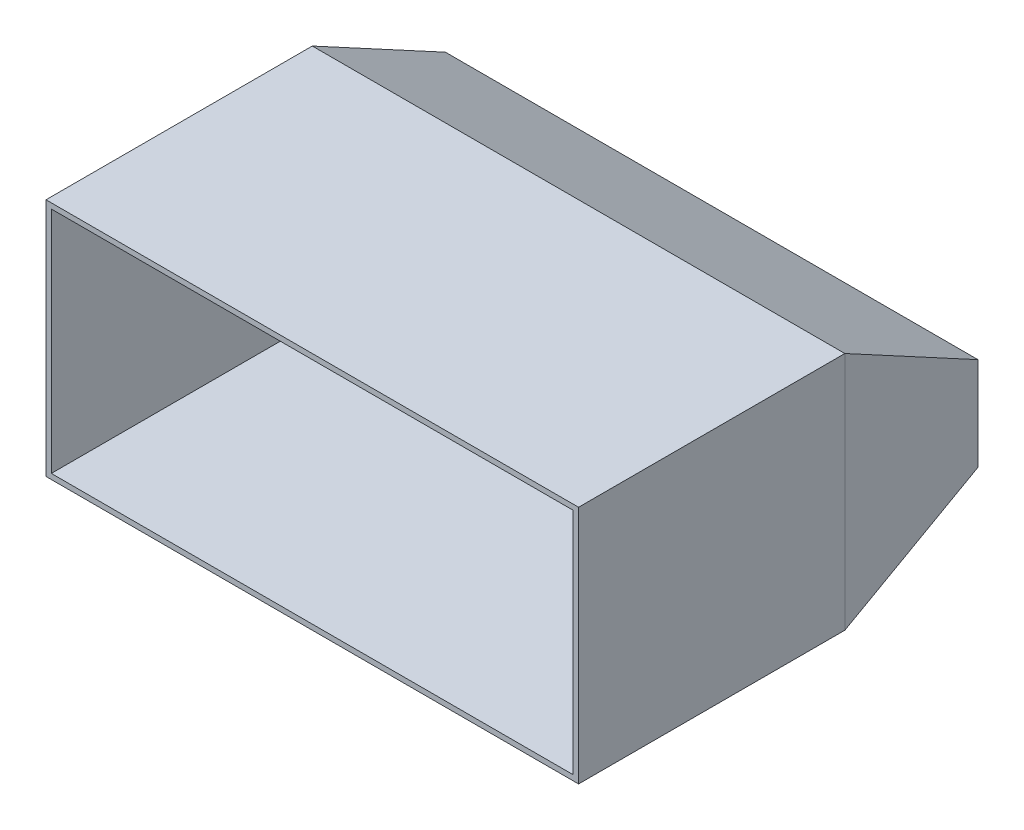
ISO-10303-21;
HEADER;
FILE_DESCRIPTION(('STEP AP214'),'2;1');
FILE_NAME('part.step','',(''),(''),'','','');
FILE_SCHEMA(('AUTOMOTIVE_DESIGN { 1 0 10303 214 1 1 1 1 }'));
ENDSEC;
DATA;
#1=APPLICATION_CONTEXT('core data for automotive mechanical design processes');
#2=APPLICATION_PROTOCOL_DEFINITION('international standard','automotive_design',2000,#1);
#3=PRODUCT_CONTEXT('',#1,'mechanical');
#4=PRODUCT('Part','Part','',(#3));
#5=PRODUCT_RELATED_PRODUCT_CATEGORY('part','',(#4));
#6=PRODUCT_DEFINITION_FORMATION('','',#4);
#7=PRODUCT_DEFINITION_CONTEXT('part definition',#1,'design');
#8=PRODUCT_DEFINITION('design','',#6,#7);
#9=PRODUCT_DEFINITION_SHAPE('','',#8);
#10=(LENGTH_UNIT() NAMED_UNIT(*) SI_UNIT(.MILLI.,.METRE.));
#11=(NAMED_UNIT(*) PLANE_ANGLE_UNIT() SI_UNIT($,.RADIAN.));
#12=(NAMED_UNIT(*) SI_UNIT($,.STERADIAN.) SOLID_ANGLE_UNIT());
#13=UNCERTAINTY_MEASURE_WITH_UNIT(LENGTH_MEASURE(1.E-05),#10,'distance_accuracy_value','');
#14=(GEOMETRIC_REPRESENTATION_CONTEXT(3) GLOBAL_UNCERTAINTY_ASSIGNED_CONTEXT((#13)) GLOBAL_UNIT_ASSIGNED_CONTEXT((#10,
#11,#12)) REPRESENTATION_CONTEXT('',''));
#15=CARTESIAN_POINT('',(0.,0.,0.));
#16=DIRECTION('',(0.,0.,1.));
#17=DIRECTION('',(1.,0.,0.));
#18=AXIS2_PLACEMENT_3D('',#15,#16,#17);
#19=CARTESIAN_POINT('',(0.,0.,0.));
#20=DIRECTION('',(-1.,0.,0.));
#21=DIRECTION('',(0.,0.,1.));
#22=AXIS2_PLACEMENT_3D('',#19,#20,#21);
#23=PLANE('',#22);
#24=DIRECTION('',(0.,-0.488603368931843,0.87250601594972));
#25=VECTOR('',#24,1.);
#26=CARTESIAN_POINT('',(0.,-62.,-50.));
#27=LINE('',#26,#25);
#28=CARTESIAN_POINT('',(0.,-62.,-50.));
#29=VERTEX_POINT('',#28);
#30=CARTESIAN_POINT('',(0.,-90.,0.));
#31=VERTEX_POINT('',#30);
#32=EDGE_CURVE('E103',#29,#31,#27,.T.);
#33=ORIENTED_EDGE('',*,*,#32,.T.);
#34=DIRECTION('',(0.,1.,0.));
#35=VECTOR('',#34,1.);
#36=CARTESIAN_POINT('',(0.,0.,0.));
#37=LINE('',#36,#35);
#38=CARTESIAN_POINT('',(0.,0.,0.));
#39=VERTEX_POINT('',#38);
#40=EDGE_CURVE('E100',#31,#39,#37,.T.);
#41=ORIENTED_EDGE('',*,*,#40,.T.);
#42=DIRECTION('',(0.,0.475148914734884,0.879905397657192));
#43=VECTOR('',#42,1.);
#44=CARTESIAN_POINT('',(0.,-27.,-50.));
#45=LINE('',#44,#43);
#46=CARTESIAN_POINT('',(0.,-27.,-50.));
#47=VERTEX_POINT('',#46);
#48=EDGE_CURVE('E92',#47,#39,#45,.T.);
#49=ORIENTED_EDGE('',*,*,#48,.F.);
#50=DIRECTION('',(0.,-1.,0.));
#51=VECTOR('',#50,1.);
#52=CARTESIAN_POINT('',(0.,-27.,-50.));
#53=LINE('',#52,#51);
#54=EDGE_CURVE('E85',#47,#29,#53,.T.);
#55=ORIENTED_EDGE('',*,*,#54,.T.);
#56=EDGE_LOOP('',(#33,#41,#49,#55));
#57=FACE_BOUND('',#56,.T.);
#58=ADVANCED_FACE('F44',(#57),#23,.T.);
#59=CARTESIAN_POINT('',(0.,0.,0.));
#60=DIRECTION('',(0.,0.879905397657193,-0.475148914734884));
#61=DIRECTION('',(0.,0.475148914734884,0.879905397657193));
#62=AXIS2_PLACEMENT_3D('',#59,#60,#61);
#63=PLANE('',#62);
#64=ORIENTED_EDGE('',*,*,#48,.T.);
#65=DIRECTION('',(1.,0.,0.));
#66=VECTOR('',#65,1.);
#67=CARTESIAN_POINT('',(200.,0.,0.));
#68=LINE('',#67,#66);
#69=CARTESIAN_POINT('',(200.,0.,0.));
#70=VERTEX_POINT('',#69);
#71=EDGE_CURVE('E60',#39,#70,#68,.T.);
#72=ORIENTED_EDGE('',*,*,#71,.T.);
#73=DIRECTION('',(0.,0.475148914734884,0.879905397657192));
#74=VECTOR('',#73,1.);
#75=CARTESIAN_POINT('',(200.,-27.,-50.));
#76=LINE('',#75,#74);
#77=CARTESIAN_POINT('',(200.,-27.,-50.));
#78=VERTEX_POINT('',#77);
#79=EDGE_CURVE('E47',#78,#70,#76,.T.);
#80=ORIENTED_EDGE('',*,*,#79,.F.);
#81=DIRECTION('',(-1.,0.,0.));
#82=VECTOR('',#81,1.);
#83=CARTESIAN_POINT('',(0.,-27.,-50.));
#84=LINE('',#83,#82);
#85=EDGE_CURVE('E94',#78,#47,#84,.T.);
#86=ORIENTED_EDGE('',*,*,#85,.T.);
#87=EDGE_LOOP('',(#64,#72,#80,#86));
#88=FACE_BOUND('',#87,.T.);
#89=ADVANCED_FACE('F95',(#88),#63,.T.);
#90=CARTESIAN_POINT('',(0.,-68.5140073081608,-38.36784409257));
#91=DIRECTION('',(0.,-0.87250601594972,-0.488603368931843));
#92=DIRECTION('',(0.,0.488603368931843,-0.87250601594972));
#93=AXIS2_PLACEMENT_3D('',#90,#91,#92);
#94=PLANE('',#93);
#95=DIRECTION('',(0.,-0.488603368931843,0.87250601594972));
#96=VECTOR('',#95,1.);
#97=CARTESIAN_POINT('',(200.,-62.,-50.));
#98=LINE('',#97,#96);
#99=CARTESIAN_POINT('',(200.,-62.,-50.));
#100=VERTEX_POINT('',#99);
#101=CARTESIAN_POINT('',(200.,-90.,0.));
#102=VERTEX_POINT('',#101);
#103=EDGE_CURVE('E97',#100,#102,#98,.T.);
#104=ORIENTED_EDGE('',*,*,#103,.T.);
#105=DIRECTION('',(-1.,0.,0.));
#106=VECTOR('',#105,1.);
#107=CARTESIAN_POINT('',(200.,-90.,0.));
#108=LINE('',#107,#106);
#109=EDGE_CURVE('E112',#102,#31,#108,.T.);
#110=ORIENTED_EDGE('',*,*,#109,.T.);
#111=ORIENTED_EDGE('',*,*,#32,.F.);
#112=DIRECTION('',(1.,0.,0.));
#113=VECTOR('',#112,1.);
#114=CARTESIAN_POINT('',(0.,-62.,-50.));
#115=LINE('',#114,#113);
#116=EDGE_CURVE('E109',#29,#100,#115,.T.);
#117=ORIENTED_EDGE('',*,*,#116,.T.);
#118=EDGE_LOOP('',(#104,#110,#111,#117));
#119=FACE_BOUND('',#118,.T.);
#120=ADVANCED_FACE('F121',(#119),#94,.T.);
#121=CARTESIAN_POINT('',(200.,0.,0.));
#122=DIRECTION('',(1.,0.,0.));
#123=DIRECTION('',(0.,0.,-1.));
#124=AXIS2_PLACEMENT_3D('',#121,#122,#123);
#125=PLANE('',#124);
#126=ORIENTED_EDGE('',*,*,#79,.T.);
#127=DIRECTION('',(0.,-1.,0.));
#128=VECTOR('',#127,1.);
#129=CARTESIAN_POINT('',(200.,0.,0.));
#130=LINE('',#129,#128);
#131=EDGE_CURVE('E52',#70,#102,#130,.T.);
#132=ORIENTED_EDGE('',*,*,#131,.T.);
#133=ORIENTED_EDGE('',*,*,#103,.F.);
#134=DIRECTION('',(0.,1.,0.));
#135=VECTOR('',#134,1.);
#136=CARTESIAN_POINT('',(200.,-27.,-50.));
#137=LINE('',#136,#135);
#138=EDGE_CURVE('E12',#100,#78,#137,.T.);
#139=ORIENTED_EDGE('',*,*,#138,.T.);
#140=EDGE_LOOP('',(#126,#132,#133,#139));
#141=FACE_BOUND('',#140,.T.);
#142=ADVANCED_FACE('F45',(#141),#125,.T.);
#143=OPEN_SHELL('',(#58,#89,#120,#142));
#144=SHELL_BASED_SURFACE_MODEL('B2',(#143));
#145=CARTESIAN_POINT('',(0.,0.,100.));
#146=DIRECTION('',(0.,0.,1.));
#147=DIRECTION('',(1.,0.,0.));
#148=AXIS2_PLACEMENT_3D('',#145,#146,#147);
#149=PLANE('',#148);
#150=DIRECTION('',(0.,-1.,0.));
#151=VECTOR('',#150,1.);
#152=CARTESIAN_POINT('',(0.,0.,100.));
#153=LINE('',#152,#151);
#154=CARTESIAN_POINT('',(0.,0.,100.));
#155=VERTEX_POINT('',#154);
#156=CARTESIAN_POINT('',(0.,-90.,100.));
#157=VERTEX_POINT('',#156);
#158=EDGE_CURVE('E270',#155,#157,#153,.T.);
#159=ORIENTED_EDGE('',*,*,#158,.T.);
#160=DIRECTION('',(1.,0.,0.));
#161=VECTOR('',#160,1.);
#162=CARTESIAN_POINT('',(0.,-90.,100.));
#163=LINE('',#162,#161);
#164=CARTESIAN_POINT('',(200.,-90.,100.));
#165=VERTEX_POINT('',#164);
#166=EDGE_CURVE('E273',#157,#165,#163,.T.);
#167=ORIENTED_EDGE('',*,*,#166,.T.);
#168=DIRECTION('',(0.,1.,0.));
#169=VECTOR('',#168,1.);
#170=CARTESIAN_POINT('',(200.,0.,100.));
#171=LINE('',#170,#169);
#172=CARTESIAN_POINT('',(200.,0.,100.));
#173=VERTEX_POINT('',#172);
#174=EDGE_CURVE('E276',#165,#173,#171,.T.);
#175=ORIENTED_EDGE('',*,*,#174,.T.);
#176=DIRECTION('',(-1.,0.,0.));
#177=VECTOR('',#176,1.);
#178=CARTESIAN_POINT('',(0.,0.,100.));
#179=LINE('',#178,#177);
#180=EDGE_CURVE('E278',#173,#155,#179,.T.);
#181=ORIENTED_EDGE('',*,*,#180,.T.);
#182=EDGE_LOOP('',(#159,#167,#175,#181));
#183=FACE_BOUND('',#182,.T.);
#184=DIRECTION('',(0.,-1.,0.));
#185=VECTOR('',#184,1.);
#186=CARTESIAN_POINT('',(2.,-2.,100.));
#187=LINE('',#186,#185);
#188=CARTESIAN_POINT('',(2.,-2.,100.));
#189=VERTEX_POINT('',#188);
#190=CARTESIAN_POINT('',(2.,-88.,100.));
#191=VERTEX_POINT('',#190);
#192=EDGE_CURVE('E242',#189,#191,#187,.T.);
#193=ORIENTED_EDGE('',*,*,#192,.F.);
#194=DIRECTION('',(-1.,0.,0.));
#195=VECTOR('',#194,1.);
#196=CARTESIAN_POINT('',(2.,-2.,100.));
#197=LINE('',#196,#195);
#198=CARTESIAN_POINT('',(198.,-2.,100.));
#199=VERTEX_POINT('',#198);
#200=EDGE_CURVE('E234',#199,#189,#197,.T.);
#201=ORIENTED_EDGE('',*,*,#200,.F.);
#202=DIRECTION('',(0.,1.,0.));
#203=VECTOR('',#202,1.);
#204=CARTESIAN_POINT('',(198.,-2.,100.));
#205=LINE('',#204,#203);
#206=CARTESIAN_POINT('',(198.,-88.,100.));
#207=VERTEX_POINT('',#206);
#208=EDGE_CURVE('E256',#207,#199,#205,.T.);
#209=ORIENTED_EDGE('',*,*,#208,.F.);
#210=DIRECTION('',(1.,0.,0.));
#211=VECTOR('',#210,1.);
#212=CARTESIAN_POINT('',(2.,-88.,100.));
#213=LINE('',#212,#211);
#214=EDGE_CURVE('E254',#191,#207,#213,.T.);
#215=ORIENTED_EDGE('',*,*,#214,.F.);
#216=EDGE_LOOP('',(#193,#201,#209,#215));
#217=FACE_BOUND('',#216,.T.);
#218=ADVANCED_FACE('F169',(#183,#217),#149,.T.);
#219=CARTESIAN_POINT('',(0.,0.,0.));
#220=DIRECTION('',(0.,0.,1.));
#221=DIRECTION('',(1.,0.,0.));
#222=AXIS2_PLACEMENT_3D('',#219,#220,#221);
#223=PLANE('',#222);
#224=DIRECTION('',(0.,-1.,0.));
#225=VECTOR('',#224,1.);
#226=CARTESIAN_POINT('',(0.,0.,0.));
#227=LINE('',#226,#225);
#228=CARTESIAN_POINT('',(0.,0.,0.));
#229=VERTEX_POINT('',#228);
#230=CARTESIAN_POINT('',(0.,-90.,0.));
#231=VERTEX_POINT('',#230);
#232=EDGE_CURVE('E250',#229,#231,#227,.T.);
#233=ORIENTED_EDGE('',*,*,#232,.F.);
#234=DIRECTION('',(-1.,0.,0.));
#235=VECTOR('',#234,1.);
#236=CARTESIAN_POINT('',(0.,0.,0.));
#237=LINE('',#236,#235);
#238=CARTESIAN_POINT('',(200.,0.,0.));
#239=VERTEX_POINT('',#238);
#240=EDGE_CURVE('E274',#239,#229,#237,.T.);
#241=ORIENTED_EDGE('',*,*,#240,.F.);
#242=DIRECTION('',(0.,1.,0.));
#243=VECTOR('',#242,1.);
#244=CARTESIAN_POINT('',(200.,0.,0.));
#245=LINE('',#244,#243);
#246=CARTESIAN_POINT('',(200.,-90.,0.));
#247=VERTEX_POINT('',#246);
#248=EDGE_CURVE('E285',#247,#239,#245,.T.);
#249=ORIENTED_EDGE('',*,*,#248,.F.);
#250=DIRECTION('',(1.,0.,0.));
#251=VECTOR('',#250,1.);
#252=CARTESIAN_POINT('',(0.,-90.,0.));
#253=LINE('',#252,#251);
#254=EDGE_CURVE('E283',#231,#247,#253,.T.);
#255=ORIENTED_EDGE('',*,*,#254,.F.);
#256=EDGE_LOOP('',(#233,#241,#249,#255));
#257=FACE_BOUND('',#256,.T.);
#258=DIRECTION('',(-1.,0.,0.));
#259=VECTOR('',#258,1.);
#260=CARTESIAN_POINT('',(2.,-2.,0.));
#261=LINE('',#260,#259);
#262=CARTESIAN_POINT('',(198.,-2.,0.));
#263=VERTEX_POINT('',#262);
#264=CARTESIAN_POINT('',(2.,-2.,0.));
#265=VERTEX_POINT('',#264);
#266=EDGE_CURVE('E192',#263,#265,#261,.T.);
#267=ORIENTED_EDGE('',*,*,#266,.T.);
#268=DIRECTION('',(0.,-1.,0.));
#269=VECTOR('',#268,1.);
#270=CARTESIAN_POINT('',(2.,-2.,0.));
#271=LINE('',#270,#269);
#272=CARTESIAN_POINT('',(2.,-88.,0.));
#273=VERTEX_POINT('',#272);
#274=EDGE_CURVE('E249',#265,#273,#271,.T.);
#275=ORIENTED_EDGE('',*,*,#274,.T.);
#276=DIRECTION('',(1.,0.,0.));
#277=VECTOR('',#276,1.);
#278=CARTESIAN_POINT('',(2.,-88.,0.));
#279=LINE('',#278,#277);
#280=CARTESIAN_POINT('',(198.,-88.,0.));
#281=VERTEX_POINT('',#280);
#282=EDGE_CURVE('E262',#273,#281,#279,.T.);
#283=ORIENTED_EDGE('',*,*,#282,.T.);
#284=DIRECTION('',(0.,1.,0.));
#285=VECTOR('',#284,1.);
#286=CARTESIAN_POINT('',(198.,-2.,0.));
#287=LINE('',#286,#285);
#288=EDGE_CURVE('E243',#281,#263,#287,.T.);
#289=ORIENTED_EDGE('',*,*,#288,.T.);
#290=EDGE_LOOP('',(#267,#275,#283,#289));
#291=FACE_BOUND('',#290,.T.);
#292=ADVANCED_FACE('F303',(#257,#291),#223,.F.);
#293=CARTESIAN_POINT('',(0.,0.,100.));
#294=DIRECTION('',(1.,0.,0.));
#295=DIRECTION('',(0.,1.,0.));
#296=AXIS2_PLACEMENT_3D('',#293,#294,#295);
#297=PLANE('',#296);
#298=ORIENTED_EDGE('',*,*,#232,.T.);
#299=DIRECTION('',(0.,0.,-1.));
#300=VECTOR('',#299,1.);
#301=CARTESIAN_POINT('',(0.,-90.,100.));
#302=LINE('',#301,#300);
#303=EDGE_CURVE('E42',#157,#231,#302,.T.);
#304=ORIENTED_EDGE('',*,*,#303,.F.);
#305=ORIENTED_EDGE('',*,*,#158,.F.);
#306=DIRECTION('',(0.,0.,-1.));
#307=VECTOR('',#306,1.);
#308=CARTESIAN_POINT('',(0.,0.,100.));
#309=LINE('',#308,#307);
#310=EDGE_CURVE('E280',#155,#229,#309,.T.);
#311=ORIENTED_EDGE('',*,*,#310,.T.);
#312=EDGE_LOOP('',(#298,#304,#305,#311));
#313=FACE_BOUND('',#312,.T.);
#314=ADVANCED_FACE('F171',(#313),#297,.F.);
#315=CARTESIAN_POINT('',(0.,-90.,100.));
#316=DIRECTION('',(0.,1.,0.));
#317=DIRECTION('',(0.,0.,1.));
#318=AXIS2_PLACEMENT_3D('',#315,#316,#317);
#319=PLANE('',#318);
#320=ORIENTED_EDGE('',*,*,#254,.T.);
#321=DIRECTION('',(0.,0.,-1.));
#322=VECTOR('',#321,1.);
#323=CARTESIAN_POINT('',(200.,-90.,100.));
#324=LINE('',#323,#322);
#325=EDGE_CURVE('E177',#165,#247,#324,.T.);
#326=ORIENTED_EDGE('',*,*,#325,.F.);
#327=ORIENTED_EDGE('',*,*,#166,.F.);
#328=ORIENTED_EDGE('',*,*,#303,.T.);
#329=EDGE_LOOP('',(#320,#326,#327,#328));
#330=FACE_BOUND('',#329,.T.);
#331=ADVANCED_FACE('F313',(#330),#319,.F.);
#332=CARTESIAN_POINT('',(200.,0.,100.));
#333=DIRECTION('',(-1.,0.,0.));
#334=DIRECTION('',(0.,-1.,0.));
#335=AXIS2_PLACEMENT_3D('',#332,#333,#334);
#336=PLANE('',#335);
#337=ORIENTED_EDGE('',*,*,#248,.T.);
#338=DIRECTION('',(0.,0.,-1.));
#339=VECTOR('',#338,1.);
#340=CARTESIAN_POINT('',(200.,0.,100.));
#341=LINE('',#340,#339);
#342=EDGE_CURVE('E290',#173,#239,#341,.T.);
#343=ORIENTED_EDGE('',*,*,#342,.F.);
#344=ORIENTED_EDGE('',*,*,#174,.F.);
#345=ORIENTED_EDGE('',*,*,#325,.T.);
#346=EDGE_LOOP('',(#337,#343,#344,#345));
#347=FACE_BOUND('',#346,.T.);
#348=ADVANCED_FACE('F297',(#347),#336,.F.);
#349=CARTESIAN_POINT('',(0.,0.,100.));
#350=DIRECTION('',(0.,-1.,0.));
#351=DIRECTION('',(0.,0.,-1.));
#352=AXIS2_PLACEMENT_3D('',#349,#350,#351);
#353=PLANE('',#352);
#354=ORIENTED_EDGE('',*,*,#240,.T.);
#355=ORIENTED_EDGE('',*,*,#310,.F.);
#356=ORIENTED_EDGE('',*,*,#180,.F.);
#357=ORIENTED_EDGE('',*,*,#342,.T.);
#358=EDGE_LOOP('',(#354,#355,#356,#357));
#359=FACE_BOUND('',#358,.T.);
#360=ADVANCED_FACE('F307',(#359),#353,.F.);
#361=CARTESIAN_POINT('',(2.,-2.,100.));
#362=DIRECTION('',(0.,-1.,0.));
#363=DIRECTION('',(0.,0.,-1.));
#364=AXIS2_PLACEMENT_3D('',#361,#362,#363);
#365=PLANE('',#364);
#366=ORIENTED_EDGE('',*,*,#266,.F.);
#367=DIRECTION('',(0.,0.,-1.));
#368=VECTOR('',#367,1.);
#369=CARTESIAN_POINT('',(198.,-2.,100.));
#370=LINE('',#369,#368);
#371=EDGE_CURVE('E238',#199,#263,#370,.T.);
#372=ORIENTED_EDGE('',*,*,#371,.F.);
#373=ORIENTED_EDGE('',*,*,#200,.T.);
#374=DIRECTION('',(0.,0.,-1.));
#375=VECTOR('',#374,1.);
#376=CARTESIAN_POINT('',(2.,-2.,100.));
#377=LINE('',#376,#375);
#378=EDGE_CURVE('E237',#189,#265,#377,.T.);
#379=ORIENTED_EDGE('',*,*,#378,.T.);
#380=EDGE_LOOP('',(#366,#372,#373,#379));
#381=FACE_BOUND('',#380,.T.);
#382=ADVANCED_FACE('F236',(#381),#365,.T.);
#383=CARTESIAN_POINT('',(2.,-2.,100.));
#384=DIRECTION('',(1.,0.,0.));
#385=DIRECTION('',(0.,0.,-1.));
#386=AXIS2_PLACEMENT_3D('',#383,#384,#385);
#387=PLANE('',#386);
#388=ORIENTED_EDGE('',*,*,#274,.F.);
#389=ORIENTED_EDGE('',*,*,#378,.F.);
#390=ORIENTED_EDGE('',*,*,#192,.T.);
#391=DIRECTION('',(0.,0.,-1.));
#392=VECTOR('',#391,1.);
#393=CARTESIAN_POINT('',(2.,-88.,100.));
#394=LINE('',#393,#392);
#395=EDGE_CURVE('E251',#191,#273,#394,.T.);
#396=ORIENTED_EDGE('',*,*,#395,.T.);
#397=EDGE_LOOP('',(#388,#389,#390,#396));
#398=FACE_BOUND('',#397,.T.);
#399=ADVANCED_FACE('F246',(#398),#387,.T.);
#400=CARTESIAN_POINT('',(2.,-88.,100.));
#401=DIRECTION('',(0.,1.,0.));
#402=DIRECTION('',(0.,0.,1.));
#403=AXIS2_PLACEMENT_3D('',#400,#401,#402);
#404=PLANE('',#403);
#405=ORIENTED_EDGE('',*,*,#282,.F.);
#406=ORIENTED_EDGE('',*,*,#395,.F.);
#407=ORIENTED_EDGE('',*,*,#214,.T.);
#408=DIRECTION('',(0.,0.,-1.));
#409=VECTOR('',#408,1.);
#410=CARTESIAN_POINT('',(198.,-88.,100.));
#411=LINE('',#410,#409);
#412=EDGE_CURVE('E184',#207,#281,#411,.T.);
#413=ORIENTED_EDGE('',*,*,#412,.T.);
#414=EDGE_LOOP('',(#405,#406,#407,#413));
#415=FACE_BOUND('',#414,.T.);
#416=ADVANCED_FACE('F336',(#415),#404,.T.);
#417=CARTESIAN_POINT('',(198.,-2.,100.));
#418=DIRECTION('',(-1.,0.,0.));
#419=DIRECTION('',(0.,0.,1.));
#420=AXIS2_PLACEMENT_3D('',#417,#418,#419);
#421=PLANE('',#420);
#422=ORIENTED_EDGE('',*,*,#288,.F.);
#423=ORIENTED_EDGE('',*,*,#412,.F.);
#424=ORIENTED_EDGE('',*,*,#208,.T.);
#425=ORIENTED_EDGE('',*,*,#371,.T.);
#426=EDGE_LOOP('',(#422,#423,#424,#425));
#427=FACE_BOUND('',#426,.T.);
#428=ADVANCED_FACE('F340',(#427),#421,.T.);
#429=CLOSED_SHELL('',(#218,#292,#314,#331,#348,#360,#382,#399,#416,#428));
#430=MANIFOLD_SOLID_BREP('B6',#429);
#431=ADVANCED_BREP_SHAPE_REPRESENTATION('',(#18,#430),#14);
#432=MANIFOLD_SURFACE_SHAPE_REPRESENTATION('',(#18,#144),#14);
#433=SHAPE_REPRESENTATION('',(#18),#14);
#434=SHAPE_DEFINITION_REPRESENTATION(#9,#433);
#435=SHAPE_REPRESENTATION_RELATIONSHIP('','',#433,#431);
#436=SHAPE_REPRESENTATION_RELATIONSHIP('','',#433,#432);
ENDSEC;
END-ISO-10303-21;
